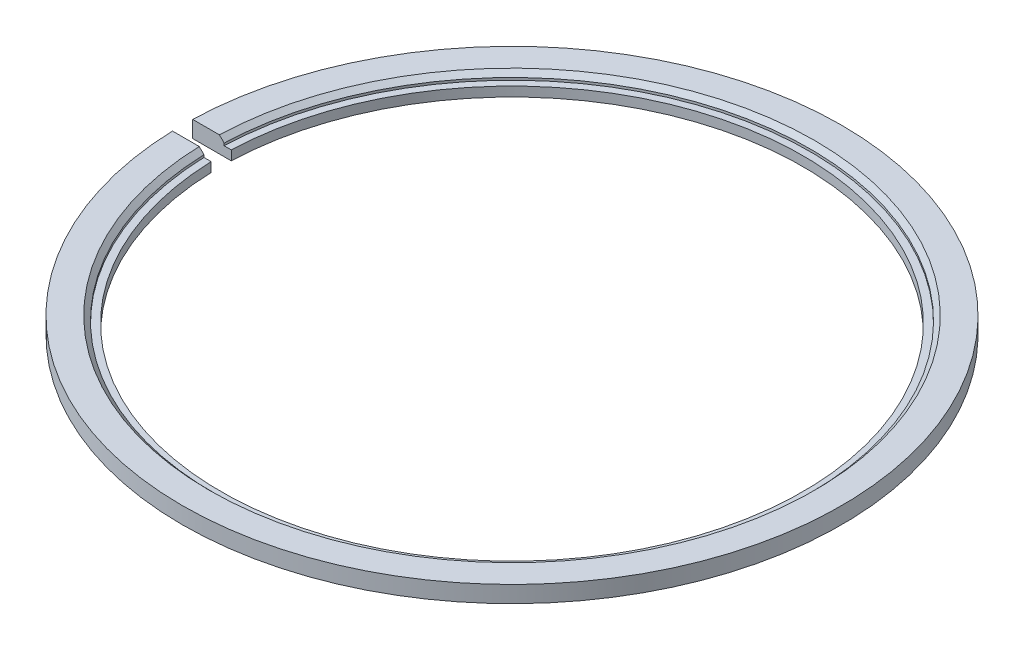
ISO-10303-21;
HEADER;
FILE_DESCRIPTION(('STEP AP214'),'2;1');
FILE_NAME('part.step','',(''),(''),'','','');
FILE_SCHEMA(('AUTOMOTIVE_DESIGN { 1 0 10303 214 1 1 1 1 }'));
ENDSEC;
DATA;
#1=APPLICATION_CONTEXT('core data for automotive mechanical design processes');
#2=APPLICATION_PROTOCOL_DEFINITION('international standard','automotive_design',2000,#1);
#3=PRODUCT_CONTEXT('',#1,'mechanical');
#4=PRODUCT('Part','Part','',(#3));
#5=PRODUCT_RELATED_PRODUCT_CATEGORY('part','',(#4));
#6=PRODUCT_DEFINITION_FORMATION('','',#4);
#7=PRODUCT_DEFINITION_CONTEXT('part definition',#1,'design');
#8=PRODUCT_DEFINITION('design','',#6,#7);
#9=PRODUCT_DEFINITION_SHAPE('','',#8);
#10=(LENGTH_UNIT() NAMED_UNIT(*) SI_UNIT(.MILLI.,.METRE.));
#11=(NAMED_UNIT(*) PLANE_ANGLE_UNIT() SI_UNIT($,.RADIAN.));
#12=(NAMED_UNIT(*) SI_UNIT($,.STERADIAN.) SOLID_ANGLE_UNIT());
#13=UNCERTAINTY_MEASURE_WITH_UNIT(LENGTH_MEASURE(1.E-05),#10,'distance_accuracy_value','');
#14=(GEOMETRIC_REPRESENTATION_CONTEXT(3) GLOBAL_UNCERTAINTY_ASSIGNED_CONTEXT((#13)) GLOBAL_UNIT_ASSIGNED_CONTEXT((#10,
#11,#12)) REPRESENTATION_CONTEXT('',''));
#15=CARTESIAN_POINT('',(0.,0.,0.));
#16=DIRECTION('',(0.,0.,1.));
#17=DIRECTION('',(1.,0.,0.));
#18=AXIS2_PLACEMENT_3D('',#15,#16,#17);
#19=CARTESIAN_POINT('',(0.,0.,0.));
#20=DIRECTION('',(0.,-0.999999999999999,0.));
#21=DIRECTION('',(0.,0.,-1.));
#22=AXIS2_PLACEMENT_3D('',#19,#20,#21);
#23=CYLINDRICAL_SURFACE('',#22,35.2425);
#24=DIRECTION('',(0.,-0.999999999999999,0.));
#25=VECTOR('',#24,1.);
#26=CARTESIAN_POINT('',(-35.2259632373623,0.,1.07950000000001));
#27=LINE('',#26,#25);
#28=CARTESIAN_POINT('',(-35.2259632373623,0.,1.07950000000001));
#29=VERTEX_POINT('',#28);
#30=CARTESIAN_POINT('',(-35.2259632373623,1.778,1.07950000000001));
#31=VERTEX_POINT('',#30);
#32=EDGE_CURVE('E126',#29,#31,#27,.F.);
#33=ORIENTED_EDGE('',*,*,#32,.F.);
#34=CARTESIAN_POINT('',(0.,0.,0.));
#35=DIRECTION('',(0.,-0.999999999999999,0.));
#36=DIRECTION('',(0.,0.,-1.));
#37=AXIS2_PLACEMENT_3D('',#34,#35,#36);
#38=CIRCLE('',#37,35.2425);
#39=CARTESIAN_POINT('',(-35.2259632373623,0.,-1.07949999999999));
#40=VERTEX_POINT('',#39);
#41=EDGE_CURVE('E122',#40,#29,#38,.T.);
#42=ORIENTED_EDGE('',*,*,#41,.F.);
#43=DIRECTION('',(0.,-0.999999999999999,0.));
#44=VECTOR('',#43,1.);
#45=CARTESIAN_POINT('',(-35.2259632373623,0.,-1.07949999999999));
#46=LINE('',#45,#44);
#47=CARTESIAN_POINT('',(-35.2259632373623,1.778,-1.07949999999999));
#48=VERTEX_POINT('',#47);
#49=EDGE_CURVE('E103',#48,#40,#46,.T.);
#50=ORIENTED_EDGE('',*,*,#49,.F.);
#51=CARTESIAN_POINT('',(0.,1.778,0.));
#52=DIRECTION('',(0.,-0.999999999999999,0.));
#53=DIRECTION('',(0.,0.,-1.));
#54=AXIS2_PLACEMENT_3D('',#51,#52,#53);
#55=CIRCLE('',#54,35.2425);
#56=EDGE_CURVE('E132',#48,#31,#55,.T.);
#57=ORIENTED_EDGE('',*,*,#56,.T.);
#58=EDGE_LOOP('',(#33,#42,#50,#57));
#59=FACE_BOUND('',#58,.T.);
#60=ADVANCED_FACE('F36',(#59),#23,.T.);
#61=CARTESIAN_POINT('',(35.2425,1.778,0.));
#62=DIRECTION('',(0.,0.999999999999999,0.));
#63=DIRECTION('',(0.,0.,1.));
#64=AXIS2_PLACEMENT_3D('',#61,#62,#63);
#65=PLANE('',#64);
#66=DIRECTION('',(1.,0.,0.));
#67=VECTOR('',#66,1.);
#68=CARTESIAN_POINT('',(-35.2425,1.778,1.07950000000001));
#69=LINE('',#68,#67);
#70=CARTESIAN_POINT('',(-32.3670033328697,1.778,1.07950000000001));
#71=VERTEX_POINT('',#70);
#72=EDGE_CURVE('E55',#31,#71,#69,.T.);
#73=ORIENTED_EDGE('',*,*,#72,.F.);
#74=ORIENTED_EDGE('',*,*,#56,.F.);
#75=DIRECTION('',(-1.,0.,0.));
#76=VECTOR('',#75,1.);
#77=CARTESIAN_POINT('',(-35.2425,1.778,-1.07949999999999));
#78=LINE('',#77,#76);
#79=CARTESIAN_POINT('',(-32.3670033328698,1.778,-1.07949999999998));
#80=VERTEX_POINT('',#79);
#81=EDGE_CURVE('E181',#80,#48,#78,.T.);
#82=ORIENTED_EDGE('',*,*,#81,.F.);
#83=CARTESIAN_POINT('',(0.,1.778,0.));
#84=DIRECTION('',(0.,0.999999999999999,0.));
#85=DIRECTION('',(0.,0.,1.));
#86=AXIS2_PLACEMENT_3D('',#83,#84,#85);
#87=CIRCLE('',#86,32.385);
#88=EDGE_CURVE('E135',#80,#71,#87,.F.);
#89=ORIENTED_EDGE('',*,*,#88,.T.);
#90=EDGE_LOOP('',(#73,#74,#82,#89));
#91=FACE_BOUND('',#90,.T.);
#92=ADVANCED_FACE('F160',(#91),#65,.T.);
#93=CARTESIAN_POINT('',(0.,0.,0.));
#94=DIRECTION('',(0.,-0.999999999999999,0.));
#95=DIRECTION('',(0.,0.,-1.));
#96=AXIS2_PLACEMENT_3D('',#93,#94,#95);
#97=CYLINDRICAL_SURFACE('',#96,31.877);
#98=DIRECTION('',(0.,-0.999999999999999,0.));
#99=VECTOR('',#98,1.);
#100=CARTESIAN_POINT('',(-31.8587163700925,0.,1.07950000000001));
#101=LINE('',#100,#99);
#102=CARTESIAN_POINT('',(-31.8587163700925,1.26999999999999,1.07950000000001));
#103=VERTEX_POINT('',#102);
#104=CARTESIAN_POINT('',(-31.8587163700925,1.01600000000002,1.07950000000001));
#105=VERTEX_POINT('',#104);
#106=EDGE_CURVE('E171',#103,#105,#101,.T.);
#107=ORIENTED_EDGE('',*,*,#106,.F.);
#108=CARTESIAN_POINT('',(0.,1.26999999999999,0.));
#109=DIRECTION('',(0.,0.999999999999999,0.));
#110=DIRECTION('',(0.,0.,1.));
#111=AXIS2_PLACEMENT_3D('',#108,#109,#110);
#112=CIRCLE('',#111,31.877);
#113=CARTESIAN_POINT('',(-31.8587163700925,1.26999999999999,-1.07949999999999));
#114=VERTEX_POINT('',#113);
#115=EDGE_CURVE('E138',#103,#114,#112,.T.);
#116=ORIENTED_EDGE('',*,*,#115,.T.);
#117=DIRECTION('',(0.,-0.999999999999999,0.));
#118=VECTOR('',#117,1.);
#119=CARTESIAN_POINT('',(-31.8587163700925,0.,-1.07949999999999));
#120=LINE('',#119,#118);
#121=CARTESIAN_POINT('',(-31.8587163700925,1.01599999999999,-1.07949999999999));
#122=VERTEX_POINT('',#121);
#123=EDGE_CURVE('E63',#122,#114,#120,.F.);
#124=ORIENTED_EDGE('',*,*,#123,.F.);
#125=CARTESIAN_POINT('',(0.,1.01599999999999,0.));
#126=DIRECTION('',(0.,-0.999999999999999,0.));
#127=DIRECTION('',(0.,0.,-1.));
#128=AXIS2_PLACEMENT_3D('',#125,#126,#127);
#129=CIRCLE('',#128,31.877);
#130=EDGE_CURVE('E124',#122,#105,#129,.T.);
#131=ORIENTED_EDGE('',*,*,#130,.T.);
#132=EDGE_LOOP('',(#107,#116,#124,#131));
#133=FACE_BOUND('',#132,.T.);
#134=ADVANCED_FACE('F156',(#133),#97,.F.);
#135=CARTESIAN_POINT('',(31.877,1.01600000000002,0.));
#136=DIRECTION('',(0.,0.999999999999999,0.));
#137=DIRECTION('',(0.,0.,1.));
#138=AXIS2_PLACEMENT_3D('',#135,#136,#137);
#139=PLANE('',#138);
#140=DIRECTION('',(1.,0.,0.));
#141=VECTOR('',#140,1.);
#142=CARTESIAN_POINT('',(31.877,1.01600000000002,1.07949999999999));
#143=LINE('',#142,#141);
#144=CARTESIAN_POINT('',(-31.0962683412335,1.01600000000002,1.07950000000001));
#145=VERTEX_POINT('',#144);
#146=EDGE_CURVE('E170',#105,#145,#143,.T.);
#147=ORIENTED_EDGE('',*,*,#146,.F.);
#148=ORIENTED_EDGE('',*,*,#130,.F.);
#149=DIRECTION('',(-1.,0.,0.));
#150=VECTOR('',#149,1.);
#151=CARTESIAN_POINT('',(31.877,1.01600000000002,-1.07950000000002));
#152=LINE('',#151,#150);
#153=CARTESIAN_POINT('',(-31.0962683412335,1.01600000000002,-1.0795));
#154=VERTEX_POINT('',#153);
#155=EDGE_CURVE('E176',#154,#122,#152,.T.);
#156=ORIENTED_EDGE('',*,*,#155,.F.);
#157=CARTESIAN_POINT('',(0.,1.01599999999999,0.));
#158=DIRECTION('',(0.,-0.999999999999999,0.));
#159=DIRECTION('',(0.,0.,-1.));
#160=AXIS2_PLACEMENT_3D('',#157,#158,#159);
#161=CIRCLE('',#160,31.115);
#162=EDGE_CURVE('E117',#154,#145,#161,.T.);
#163=ORIENTED_EDGE('',*,*,#162,.T.);
#164=EDGE_LOOP('',(#147,#148,#156,#163));
#165=FACE_BOUND('',#164,.T.);
#166=ADVANCED_FACE('F153',(#165),#139,.T.);
#167=CARTESIAN_POINT('',(0.,0.,0.));
#168=DIRECTION('',(0.,-0.999999999999999,0.));
#169=DIRECTION('',(0.,0.,-1.));
#170=AXIS2_PLACEMENT_3D('',#167,#168,#169);
#171=CYLINDRICAL_SURFACE('',#170,31.115);
#172=DIRECTION('',(0.,0.999999999999999,0.));
#173=VECTOR('',#172,1.);
#174=CARTESIAN_POINT('',(-31.0962683412335,0.,1.07950000000001));
#175=LINE('',#174,#173);
#176=CARTESIAN_POINT('',(-31.0962683412335,0.,1.07950000000001));
#177=VERTEX_POINT('',#176);
#178=EDGE_CURVE('E118',#177,#145,#175,.T.);
#179=ORIENTED_EDGE('',*,*,#178,.T.);
#180=ORIENTED_EDGE('',*,*,#162,.F.);
#181=DIRECTION('',(0.,0.999999999999999,0.));
#182=VECTOR('',#181,1.);
#183=CARTESIAN_POINT('',(-31.0962683412335,0.,-1.0795));
#184=LINE('',#183,#182);
#185=CARTESIAN_POINT('',(-31.0962683412335,0.,-1.0795));
#186=VERTEX_POINT('',#185);
#187=EDGE_CURVE('E100',#186,#154,#184,.T.);
#188=ORIENTED_EDGE('',*,*,#187,.F.);
#189=CARTESIAN_POINT('',(0.,0.,0.));
#190=DIRECTION('',(0.,-0.999999999999999,0.));
#191=DIRECTION('',(0.,0.,-1.));
#192=AXIS2_PLACEMENT_3D('',#189,#190,#191);
#193=CIRCLE('',#192,31.115);
#194=EDGE_CURVE('E115',#186,#177,#193,.T.);
#195=ORIENTED_EDGE('',*,*,#194,.T.);
#196=EDGE_LOOP('',(#179,#180,#188,#195));
#197=FACE_BOUND('',#196,.T.);
#198=ADVANCED_FACE('F114',(#197),#171,.F.);
#199=CARTESIAN_POINT('',(31.115,0.,0.));
#200=DIRECTION('',(0.,-0.999999999999999,0.));
#201=DIRECTION('',(0.,0.,-1.));
#202=AXIS2_PLACEMENT_3D('',#199,#200,#201);
#203=PLANE('',#202);
#204=DIRECTION('',(1.,0.,0.));
#205=VECTOR('',#204,1.);
#206=CARTESIAN_POINT('',(-35.2425,0.,1.07950000000001));
#207=LINE('',#206,#205);
#208=EDGE_CURVE('E108',#29,#177,#207,.T.);
#209=ORIENTED_EDGE('',*,*,#208,.T.);
#210=ORIENTED_EDGE('',*,*,#194,.F.);
#211=DIRECTION('',(-1.,0.,0.));
#212=VECTOR('',#211,1.);
#213=CARTESIAN_POINT('',(-35.2425,0.,-1.07949999999999));
#214=LINE('',#213,#212);
#215=EDGE_CURVE('E97',#186,#40,#214,.T.);
#216=ORIENTED_EDGE('',*,*,#215,.T.);
#217=ORIENTED_EDGE('',*,*,#41,.T.);
#218=EDGE_LOOP('',(#209,#210,#216,#217));
#219=FACE_BOUND('',#218,.T.);
#220=ADVANCED_FACE('F121',(#219),#203,.T.);
#221=CARTESIAN_POINT('',(0.,1.778,0.));
#222=DIRECTION('',(0.,0.999999999999999,0.));
#223=DIRECTION('',(0.,0.,1.));
#224=AXIS2_PLACEMENT_3D('',#221,#222,#223);
#225=CONICAL_SURFACE('',#224,32.385,0.785398163397442);
#226=CARTESIAN_POINT('',(-34.1315565430707,3.5416232856148,1.07950000000001));
#227=CARTESIAN_POINT('',(-33.4771876227818,2.88757881401207,1.07950000000001));
#228=CARTESIAN_POINT('',(-32.8228074363094,2.23354561495827,1.07950000000001));
#229=CARTESIAN_POINT('',(-31.5140245309739,0.925501761924849,1.07950000000001));
#230=CARTESIAN_POINT('',(-30.8596218121108,0.271491107945227,1.07950000000001));
#231=CARTESIAN_POINT('',(-30.2052078270643,-0.38250827348546,1.07950000000001));
#232=B_SPLINE_CURVE_WITH_KNOTS('',3,(#226,#227,#228,#229,#230,#231),.UNSPECIFIED.,.F.,.F.,(4,2,
4),(0.,2.7755640301045,5.55112806030953),.UNSPECIFIED.);
#233=EDGE_CURVE('E11',#71,#103,#232,.T.);
#234=ORIENTED_EDGE('',*,*,#233,.F.);
#235=ORIENTED_EDGE('',*,*,#88,.F.);
#236=CARTESIAN_POINT('',(-30.2052078270643,-0.382508273485488,-1.07949999999999));
#237=CARTESIAN_POINT('',(-30.8596218121108,0.271491107945195,-1.07949999999999));
#238=CARTESIAN_POINT('',(-31.5140245309739,0.925501761924817,-1.07949999999999));
#239=CARTESIAN_POINT('',(-32.8228074363094,2.23354561495825,-1.07949999999999));
#240=CARTESIAN_POINT('',(-33.4771876227818,2.88757881401206,-1.07949999999999));
#241=CARTESIAN_POINT('',(-34.1315565430707,3.5416232856148,-1.07949999999999));
#242=B_SPLINE_CURVE_WITH_KNOTS('',3,(#236,#237,#238,#239,#240,#241),.UNSPECIFIED.,.F.,.F.,(4,2,
4),(0.,2.77556403020504,5.55112806030955),.UNSPECIFIED.);
#243=EDGE_CURVE('E49',#114,#80,#242,.T.);
#244=ORIENTED_EDGE('',*,*,#243,.F.);
#245=ORIENTED_EDGE('',*,*,#115,.F.);
#246=EDGE_LOOP('',(#234,#235,#244,#245));
#247=FACE_BOUND('',#246,.T.);
#248=ADVANCED_FACE('F38',(#247),#225,.F.);
#249=CARTESIAN_POINT('',(-35.2425,0.,-1.07949999999999));
#250=DIRECTION('',(0.,0.,-1.));
#251=DIRECTION('',(-1.,0.,0.));
#252=AXIS2_PLACEMENT_3D('',#249,#250,#251);
#253=PLANE('',#252);
#254=ORIENTED_EDGE('',*,*,#49,.T.);
#255=ORIENTED_EDGE('',*,*,#215,.F.);
#256=ORIENTED_EDGE('',*,*,#187,.T.);
#257=ORIENTED_EDGE('',*,*,#155,.T.);
#258=ORIENTED_EDGE('',*,*,#123,.T.);
#259=ORIENTED_EDGE('',*,*,#243,.T.);
#260=ORIENTED_EDGE('',*,*,#81,.T.);
#261=EDGE_LOOP('',(#254,#255,#256,#257,#258,#259,#260));
#262=FACE_BOUND('',#261,.T.);
#263=ADVANCED_FACE('F99',(#262),#253,.F.);
#264=CARTESIAN_POINT('',(-35.2425,0.,1.07950000000001));
#265=DIRECTION('',(0.,0.,1.));
#266=DIRECTION('',(1.,0.,0.));
#267=AXIS2_PLACEMENT_3D('',#264,#265,#266);
#268=PLANE('',#267);
#269=ORIENTED_EDGE('',*,*,#32,.T.);
#270=ORIENTED_EDGE('',*,*,#72,.T.);
#271=ORIENTED_EDGE('',*,*,#233,.T.);
#272=ORIENTED_EDGE('',*,*,#106,.T.);
#273=ORIENTED_EDGE('',*,*,#146,.T.);
#274=ORIENTED_EDGE('',*,*,#178,.F.);
#275=ORIENTED_EDGE('',*,*,#208,.F.);
#276=EDGE_LOOP('',(#269,#270,#271,#272,#273,#274,#275));
#277=FACE_BOUND('',#276,.T.);
#278=ADVANCED_FACE('F147',(#277),#268,.F.);
#279=CLOSED_SHELL('',(#60,#92,#134,#166,#198,#220,#248,#263,#278));
#280=MANIFOLD_SOLID_BREP('B2',#279);
#281=ADVANCED_BREP_SHAPE_REPRESENTATION('',(#18,#280),#14);
#282=SHAPE_DEFINITION_REPRESENTATION(#9,#281);
ENDSEC;
END-ISO-10303-21;
